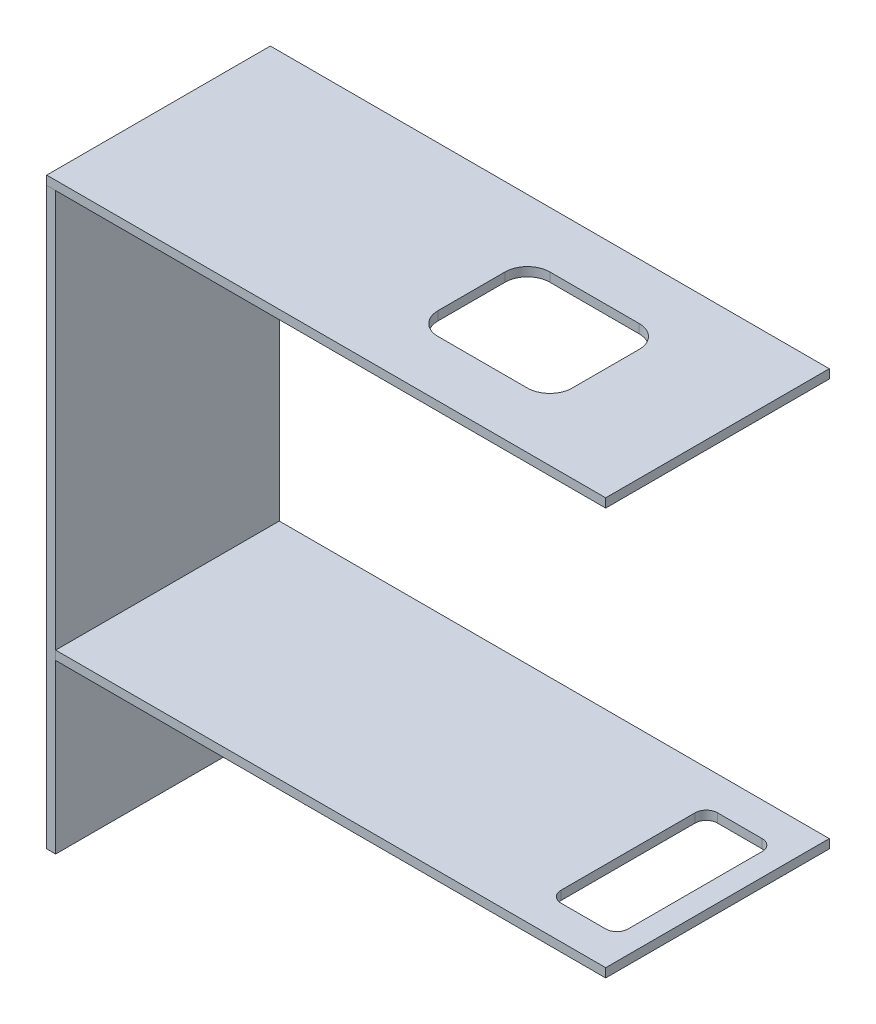
ISO-10303-21;
HEADER;
FILE_DESCRIPTION(('STEP AP214'),'2;1');
FILE_NAME('part.step','',(''),(''),'','','');
FILE_SCHEMA(('AUTOMOTIVE_DESIGN { 1 0 10303 214 1 1 1 1 }'));
ENDSEC;
DATA;
#1=APPLICATION_CONTEXT('core data for automotive mechanical design processes');
#2=APPLICATION_PROTOCOL_DEFINITION('international standard','automotive_design',2000,#1);
#3=PRODUCT_CONTEXT('',#1,'mechanical');
#4=PRODUCT('Part','Part','',(#3));
#5=PRODUCT_RELATED_PRODUCT_CATEGORY('part','',(#4));
#6=PRODUCT_DEFINITION_FORMATION('','',#4);
#7=PRODUCT_DEFINITION_CONTEXT('part definition',#1,'design');
#8=PRODUCT_DEFINITION('design','',#6,#7);
#9=PRODUCT_DEFINITION_SHAPE('','',#8);
#10=(LENGTH_UNIT() NAMED_UNIT(*) SI_UNIT(.MILLI.,.METRE.));
#11=(NAMED_UNIT(*) PLANE_ANGLE_UNIT() SI_UNIT($,.RADIAN.));
#12=(NAMED_UNIT(*) SI_UNIT($,.STERADIAN.) SOLID_ANGLE_UNIT());
#13=UNCERTAINTY_MEASURE_WITH_UNIT(LENGTH_MEASURE(1.E-05),#10,'distance_accuracy_value','');
#14=(GEOMETRIC_REPRESENTATION_CONTEXT(3) GLOBAL_UNCERTAINTY_ASSIGNED_CONTEXT((#13)) GLOBAL_UNIT_ASSIGNED_CONTEXT((#10,
#11,#12)) REPRESENTATION_CONTEXT('',''));
#15=CARTESIAN_POINT('',(0.,0.,0.));
#16=DIRECTION('',(0.,0.,1.));
#17=DIRECTION('',(1.,0.,0.));
#18=AXIS2_PLACEMENT_3D('',#15,#16,#17);
#19=CARTESIAN_POINT('',(124.,8.60422844084492E-13,100.));
#20=DIRECTION('',(-1.,0.,0.));
#21=DIRECTION('',(0.,-1.,0.));
#22=AXIS2_PLACEMENT_3D('',#19,#20,#21);
#23=PLANE('',#22);
#24=DIRECTION('',(0.,1.,0.));
#25=VECTOR('',#24,1.);
#26=CARTESIAN_POINT('',(124.,8.60422844084492E-13,0.));
#27=LINE('',#26,#25);
#28=CARTESIAN_POINT('',(124.,-53.5,0.));
#29=VERTEX_POINT('',#28);
#30=CARTESIAN_POINT('',(124.,-49.5,0.));
#31=VERTEX_POINT('',#30);
#32=EDGE_CURVE('E199',#29,#31,#27,.T.);
#33=ORIENTED_EDGE('',*,*,#32,.T.);
#34=DIRECTION('',(0.,0.,-1.));
#35=VECTOR('',#34,1.);
#36=CARTESIAN_POINT('',(124.,-49.5,100.));
#37=LINE('',#36,#35);
#38=CARTESIAN_POINT('',(124.,-49.5,100.));
#39=VERTEX_POINT('',#38);
#40=EDGE_CURVE('E12',#39,#31,#37,.T.);
#41=ORIENTED_EDGE('',*,*,#40,.F.);
#42=DIRECTION('',(0.,1.,0.));
#43=VECTOR('',#42,1.);
#44=CARTESIAN_POINT('',(124.,8.60422844084492E-13,100.));
#45=LINE('',#44,#43);
#46=CARTESIAN_POINT('',(124.,-53.5,100.));
#47=VERTEX_POINT('',#46);
#48=EDGE_CURVE('E188',#47,#39,#45,.T.);
#49=ORIENTED_EDGE('',*,*,#48,.F.);
#50=DIRECTION('',(0.,0.,-1.));
#51=VECTOR('',#50,1.);
#52=CARTESIAN_POINT('',(124.,-53.5,100.));
#53=LINE('',#52,#51);
#54=EDGE_CURVE('E198',#47,#29,#53,.T.);
#55=ORIENTED_EDGE('',*,*,#54,.T.);
#56=EDGE_LOOP('',(#33,#41,#49,#55));
#57=FACE_BOUND('',#56,.T.);
#58=ADVANCED_FACE('F46',(#57),#23,.F.);
#59=CARTESIAN_POINT('',(0.,-49.5,100.));
#60=DIRECTION('',(0.,-1.,0.));
#61=DIRECTION('',(1.,0.,0.));
#62=AXIS2_PLACEMENT_3D('',#59,#60,#61);
#63=PLANE('',#62);
#64=DIRECTION('',(1.,0.,0.));
#65=VECTOR('',#64,1.);
#66=CARTESIAN_POINT('',(0.,-49.5,15.));
#67=LINE('',#66,#65);
#68=CARTESIAN_POINT('',(89.,-49.5,15.));
#69=VERTEX_POINT('',#68);
#70=CARTESIAN_POINT('',(109.,-49.5,15.));
#71=VERTEX_POINT('',#70);
#72=EDGE_CURVE('E171',#69,#71,#67,.T.);
#73=ORIENTED_EDGE('',*,*,#72,.T.);
#74=CARTESIAN_POINT('',(109.,-49.5,20.));
#75=DIRECTION('',(0.,-1.,0.));
#76=DIRECTION('',(1.,0.,0.));
#77=AXIS2_PLACEMENT_3D('',#74,#75,#76);
#78=CIRCLE('',#77,5.);
#79=CARTESIAN_POINT('',(114.,-49.5,20.));
#80=VERTEX_POINT('',#79);
#81=EDGE_CURVE('E156',#71,#80,#78,.T.);
#82=ORIENTED_EDGE('',*,*,#81,.T.);
#83=DIRECTION('',(0.,0.,1.));
#84=VECTOR('',#83,1.);
#85=CARTESIAN_POINT('',(114.,-49.5,100.));
#86=LINE('',#85,#84);
#87=CARTESIAN_POINT('',(114.,-49.5,80.));
#88=VERTEX_POINT('',#87);
#89=EDGE_CURVE('E60',#80,#88,#86,.T.);
#90=ORIENTED_EDGE('',*,*,#89,.T.);
#91=CARTESIAN_POINT('',(109.,-49.5,80.));
#92=DIRECTION('',(0.,-1.,0.));
#93=DIRECTION('',(1.,0.,0.));
#94=AXIS2_PLACEMENT_3D('',#91,#92,#93);
#95=CIRCLE('',#94,5.);
#96=CARTESIAN_POINT('',(109.,-49.5,85.));
#97=VERTEX_POINT('',#96);
#98=EDGE_CURVE('E144',#88,#97,#95,.T.);
#99=ORIENTED_EDGE('',*,*,#98,.T.);
#100=DIRECTION('',(1.,0.,0.));
#101=VECTOR('',#100,1.);
#102=CARTESIAN_POINT('',(0.,-49.5,85.));
#103=LINE('',#102,#101);
#104=CARTESIAN_POINT('',(89.,-49.5,85.));
#105=VERTEX_POINT('',#104);
#106=EDGE_CURVE('E150',#105,#97,#103,.T.);
#107=ORIENTED_EDGE('',*,*,#106,.F.);
#108=CARTESIAN_POINT('',(89.,-49.5,80.));
#109=DIRECTION('',(0.,-1.,0.));
#110=DIRECTION('',(1.,0.,0.));
#111=AXIS2_PLACEMENT_3D('',#108,#109,#110);
#112=CIRCLE('',#111,5.);
#113=CARTESIAN_POINT('',(84.,-49.5,80.));
#114=VERTEX_POINT('',#113);
#115=EDGE_CURVE('E162',#105,#114,#112,.T.);
#116=ORIENTED_EDGE('',*,*,#115,.T.);
#117=DIRECTION('',(0.,0.,1.));
#118=VECTOR('',#117,1.);
#119=CARTESIAN_POINT('',(84.,-49.5,100.));
#120=LINE('',#119,#118);
#121=CARTESIAN_POINT('',(84.,-49.5,20.));
#122=VERTEX_POINT('',#121);
#123=EDGE_CURVE('E165',#122,#114,#120,.T.);
#124=ORIENTED_EDGE('',*,*,#123,.F.);
#125=CARTESIAN_POINT('',(89.,-49.5,20.));
#126=DIRECTION('',(0.,-1.,0.));
#127=DIRECTION('',(1.,0.,0.));
#128=AXIS2_PLACEMENT_3D('',#125,#126,#127);
#129=CIRCLE('',#128,5.);
#130=EDGE_CURVE('E168',#122,#69,#129,.T.);
#131=ORIENTED_EDGE('',*,*,#130,.T.);
#132=EDGE_LOOP('',(#73,#82,#90,#99,#107,#116,#124,#131));
#133=FACE_BOUND('',#132,.T.);
#134=DIRECTION('',(-1.,0.,0.));
#135=VECTOR('',#134,1.);
#136=CARTESIAN_POINT('',(0.,-49.5,0.));
#137=LINE('',#136,#135);
#138=CARTESIAN_POINT('',(-122.,-49.5,0.));
#139=VERTEX_POINT('',#138);
#140=EDGE_CURVE('E202',#31,#139,#137,.T.);
#141=ORIENTED_EDGE('',*,*,#140,.T.);
#142=DIRECTION('',(0.,0.,-1.));
#143=VECTOR('',#142,1.);
#144=CARTESIAN_POINT('',(-122.,-49.5,100.));
#145=LINE('',#144,#143);
#146=CARTESIAN_POINT('',(-122.,-49.5,100.));
#147=VERTEX_POINT('',#146);
#148=EDGE_CURVE('E53',#147,#139,#145,.T.);
#149=ORIENTED_EDGE('',*,*,#148,.F.);
#150=DIRECTION('',(-1.,0.,0.));
#151=VECTOR('',#150,1.);
#152=CARTESIAN_POINT('',(0.,-49.5,100.));
#153=LINE('',#152,#151);
#154=EDGE_CURVE('E191',#39,#147,#153,.T.);
#155=ORIENTED_EDGE('',*,*,#154,.F.);
#156=ORIENTED_EDGE('',*,*,#40,.T.);
#157=EDGE_LOOP('',(#141,#149,#155,#156));
#158=FACE_BOUND('',#157,.T.);
#159=ADVANCED_FACE('F154',(#133,#158),#63,.F.);
#160=CARTESIAN_POINT('',(-122.,0.,100.));
#161=DIRECTION('',(1.,0.,0.));
#162=DIRECTION('',(0.,1.,0.));
#163=AXIS2_PLACEMENT_3D('',#160,#161,#162);
#164=PLANE('',#163);
#165=DIRECTION('',(0.,-1.,0.));
#166=VECTOR('',#165,1.);
#167=CARTESIAN_POINT('',(-122.,0.,0.));
#168=LINE('',#167,#166);
#169=CARTESIAN_POINT('',(-122.,-53.5,0.));
#170=VERTEX_POINT('',#169);
#171=EDGE_CURVE('E205',#139,#170,#168,.T.);
#172=ORIENTED_EDGE('',*,*,#171,.T.);
#173=DIRECTION('',(0.,0.,-1.));
#174=VECTOR('',#173,1.);
#175=CARTESIAN_POINT('',(-122.,-53.5,100.));
#176=LINE('',#175,#174);
#177=CARTESIAN_POINT('',(-122.,-53.5,100.));
#178=VERTEX_POINT('',#177);
#179=EDGE_CURVE('E210',#178,#170,#176,.T.);
#180=ORIENTED_EDGE('',*,*,#179,.F.);
#181=DIRECTION('',(0.,-1.,0.));
#182=VECTOR('',#181,1.);
#183=CARTESIAN_POINT('',(-122.,0.,100.));
#184=LINE('',#183,#182);
#185=EDGE_CURVE('E194',#147,#178,#184,.T.);
#186=ORIENTED_EDGE('',*,*,#185,.F.);
#187=ORIENTED_EDGE('',*,*,#148,.T.);
#188=EDGE_LOOP('',(#172,#180,#186,#187));
#189=FACE_BOUND('',#188,.T.);
#190=ADVANCED_FACE('F217',(#189),#164,.F.);
#191=CARTESIAN_POINT('',(0.,-53.5,100.));
#192=DIRECTION('',(0.,1.,0.));
#193=DIRECTION('',(-1.,0.,0.));
#194=AXIS2_PLACEMENT_3D('',#191,#192,#193);
#195=PLANE('',#194);
#196=DIRECTION('',(-1.,0.,0.));
#197=VECTOR('',#196,1.);
#198=CARTESIAN_POINT('',(0.,-53.5,15.));
#199=LINE('',#198,#197);
#200=CARTESIAN_POINT('',(109.,-53.5,15.));
#201=VERTEX_POINT('',#200);
#202=CARTESIAN_POINT('',(89.,-53.5,15.));
#203=VERTEX_POINT('',#202);
#204=EDGE_CURVE('E184',#201,#203,#199,.T.);
#205=ORIENTED_EDGE('',*,*,#204,.T.);
#206=CARTESIAN_POINT('',(89.,-53.5,20.));
#207=DIRECTION('',(0.,1.,0.));
#208=DIRECTION('',(-1.,0.,0.));
#209=AXIS2_PLACEMENT_3D('',#206,#207,#208);
#210=CIRCLE('',#209,5.);
#211=CARTESIAN_POINT('',(84.,-53.5,20.));
#212=VERTEX_POINT('',#211);
#213=EDGE_CURVE('E187',#203,#212,#210,.T.);
#214=ORIENTED_EDGE('',*,*,#213,.T.);
#215=DIRECTION('',(0.,0.,-1.));
#216=VECTOR('',#215,1.);
#217=CARTESIAN_POINT('',(84.,-53.5,100.));
#218=LINE('',#217,#216);
#219=CARTESIAN_POINT('',(84.,-53.5,80.));
#220=VERTEX_POINT('',#219);
#221=EDGE_CURVE('E291',#220,#212,#218,.T.);
#222=ORIENTED_EDGE('',*,*,#221,.F.);
#223=CARTESIAN_POINT('',(89.,-53.5,80.));
#224=DIRECTION('',(0.,1.,0.));
#225=DIRECTION('',(-1.,0.,0.));
#226=AXIS2_PLACEMENT_3D('',#223,#224,#225);
#227=CIRCLE('',#226,5.);
#228=CARTESIAN_POINT('',(89.,-53.5,85.));
#229=VERTEX_POINT('',#228);
#230=EDGE_CURVE('E288',#220,#229,#227,.T.);
#231=ORIENTED_EDGE('',*,*,#230,.T.);
#232=DIRECTION('',(-1.,0.,0.));
#233=VECTOR('',#232,1.);
#234=CARTESIAN_POINT('',(0.,-53.5,85.));
#235=LINE('',#234,#233);
#236=CARTESIAN_POINT('',(109.,-53.5,85.));
#237=VERTEX_POINT('',#236);
#238=EDGE_CURVE('E286',#237,#229,#235,.T.);
#239=ORIENTED_EDGE('',*,*,#238,.F.);
#240=CARTESIAN_POINT('',(109.,-53.5,80.));
#241=DIRECTION('',(0.,1.,0.));
#242=DIRECTION('',(-1.,0.,0.));
#243=AXIS2_PLACEMENT_3D('',#240,#241,#242);
#244=CIRCLE('',#243,5.);
#245=CARTESIAN_POINT('',(114.,-53.5,80.));
#246=VERTEX_POINT('',#245);
#247=EDGE_CURVE('E282',#237,#246,#244,.T.);
#248=ORIENTED_EDGE('',*,*,#247,.T.);
#249=DIRECTION('',(0.,0.,-1.));
#250=VECTOR('',#249,1.);
#251=CARTESIAN_POINT('',(114.,-53.5,100.));
#252=LINE('',#251,#250);
#253=CARTESIAN_POINT('',(114.,-53.5,20.));
#254=VERTEX_POINT('',#253);
#255=EDGE_CURVE('E137',#246,#254,#252,.T.);
#256=ORIENTED_EDGE('',*,*,#255,.T.);
#257=CARTESIAN_POINT('',(109.,-53.5,20.));
#258=DIRECTION('',(0.,1.,0.));
#259=DIRECTION('',(-1.,0.,0.));
#260=AXIS2_PLACEMENT_3D('',#257,#258,#259);
#261=CIRCLE('',#260,5.);
#262=EDGE_CURVE('E203',#254,#201,#261,.T.);
#263=ORIENTED_EDGE('',*,*,#262,.T.);
#264=EDGE_LOOP('',(#205,#214,#222,#231,#239,#248,#256,#263));
#265=FACE_BOUND('',#264,.T.);
#266=DIRECTION('',(1.,0.,0.));
#267=VECTOR('',#266,1.);
#268=CARTESIAN_POINT('',(0.,-53.5,0.));
#269=LINE('',#268,#267);
#270=EDGE_CURVE('E192',#170,#29,#269,.T.);
#271=ORIENTED_EDGE('',*,*,#270,.T.);
#272=ORIENTED_EDGE('',*,*,#54,.F.);
#273=DIRECTION('',(1.,0.,0.));
#274=VECTOR('',#273,1.);
#275=CARTESIAN_POINT('',(0.,-53.5,100.));
#276=LINE('',#275,#274);
#277=EDGE_CURVE('E196',#178,#47,#276,.T.);
#278=ORIENTED_EDGE('',*,*,#277,.F.);
#279=ORIENTED_EDGE('',*,*,#179,.T.);
#280=EDGE_LOOP('',(#271,#272,#278,#279));
#281=FACE_BOUND('',#280,.T.);
#282=ADVANCED_FACE('F225',(#265,#281),#195,.F.);
#283=CARTESIAN_POINT('',(0.,0.,100.));
#284=DIRECTION('',(0.,0.,1.));
#285=DIRECTION('',(1.,0.,0.));
#286=AXIS2_PLACEMENT_3D('',#283,#284,#285);
#287=PLANE('',#286);
#288=ORIENTED_EDGE('',*,*,#48,.T.);
#289=ORIENTED_EDGE('',*,*,#154,.T.);
#290=ORIENTED_EDGE('',*,*,#185,.T.);
#291=ORIENTED_EDGE('',*,*,#277,.T.);
#292=EDGE_LOOP('',(#288,#289,#290,#291));
#293=FACE_BOUND('',#292,.T.);
#294=ADVANCED_FACE('F231',(#293),#287,.T.);
#295=CARTESIAN_POINT('',(0.,0.,0.));
#296=DIRECTION('',(0.,0.,1.));
#297=DIRECTION('',(1.,0.,0.));
#298=AXIS2_PLACEMENT_3D('',#295,#296,#297);
#299=PLANE('',#298);
#300=ORIENTED_EDGE('',*,*,#32,.F.);
#301=ORIENTED_EDGE('',*,*,#270,.F.);
#302=ORIENTED_EDGE('',*,*,#171,.F.);
#303=ORIENTED_EDGE('',*,*,#140,.F.);
#304=EDGE_LOOP('',(#300,#301,#302,#303));
#305=FACE_BOUND('',#304,.T.);
#306=ADVANCED_FACE('F222',(#305),#299,.F.);
#307=CARTESIAN_POINT('',(0.,-129.657731058639,15.));
#308=DIRECTION('',(0.,0.,1.));
#309=DIRECTION('',(1.,0.,0.));
#310=AXIS2_PLACEMENT_3D('',#307,#308,#309);
#311=PLANE('',#310);
#312=DIRECTION('',(0.,1.,0.));
#313=VECTOR('',#312,1.);
#314=CARTESIAN_POINT('',(109.,-129.657731058639,15.));
#315=LINE('',#314,#313);
#316=EDGE_CURVE('E68',#201,#71,#315,.T.);
#317=ORIENTED_EDGE('',*,*,#316,.T.);
#318=ORIENTED_EDGE('',*,*,#72,.F.);
#319=DIRECTION('',(0.,1.,0.));
#320=VECTOR('',#319,1.);
#321=CARTESIAN_POINT('',(89.,-129.657731058639,15.));
#322=LINE('',#321,#320);
#323=EDGE_CURVE('E174',#203,#69,#322,.T.);
#324=ORIENTED_EDGE('',*,*,#323,.F.);
#325=ORIENTED_EDGE('',*,*,#204,.F.);
#326=EDGE_LOOP('',(#317,#318,#324,#325));
#327=FACE_BOUND('',#326,.T.);
#328=ADVANCED_FACE('F244',(#327),#311,.T.);
#329=CARTESIAN_POINT('',(89.,-129.657731058639,20.));
#330=DIRECTION('',(0.,1.,0.));
#331=DIRECTION('',(-1.,0.,0.));
#332=AXIS2_PLACEMENT_3D('',#329,#330,#331);
#333=CYLINDRICAL_SURFACE('',#332,5.);
#334=ORIENTED_EDGE('',*,*,#323,.T.);
#335=ORIENTED_EDGE('',*,*,#130,.F.);
#336=DIRECTION('',(0.,1.,0.));
#337=VECTOR('',#336,1.);
#338=CARTESIAN_POINT('',(84.,-129.657731058639,20.));
#339=LINE('',#338,#337);
#340=EDGE_CURVE('E176',#212,#122,#339,.T.);
#341=ORIENTED_EDGE('',*,*,#340,.F.);
#342=ORIENTED_EDGE('',*,*,#213,.F.);
#343=EDGE_LOOP('',(#334,#335,#341,#342));
#344=FACE_BOUND('',#343,.T.);
#345=ADVANCED_FACE('F265',(#344),#333,.F.);
#346=CARTESIAN_POINT('',(84.,-129.657731058639,100.));
#347=DIRECTION('',(-1.,0.,0.));
#348=DIRECTION('',(0.,0.,1.));
#349=AXIS2_PLACEMENT_3D('',#346,#347,#348);
#350=PLANE('',#349);
#351=ORIENTED_EDGE('',*,*,#221,.T.);
#352=ORIENTED_EDGE('',*,*,#340,.T.);
#353=ORIENTED_EDGE('',*,*,#123,.T.);
#354=DIRECTION('',(0.,1.,0.));
#355=VECTOR('',#354,1.);
#356=CARTESIAN_POINT('',(84.,-129.657731058639,80.));
#357=LINE('',#356,#355);
#358=EDGE_CURVE('E178',#220,#114,#357,.T.);
#359=ORIENTED_EDGE('',*,*,#358,.F.);
#360=EDGE_LOOP('',(#351,#352,#353,#359));
#361=FACE_BOUND('',#360,.T.);
#362=ADVANCED_FACE('F261',(#361),#350,.F.);
#363=CARTESIAN_POINT('',(89.,-129.657731058639,80.));
#364=DIRECTION('',(0.,1.,0.));
#365=DIRECTION('',(-1.,0.,0.));
#366=AXIS2_PLACEMENT_3D('',#363,#364,#365);
#367=CYLINDRICAL_SURFACE('',#366,5.);
#368=ORIENTED_EDGE('',*,*,#358,.T.);
#369=ORIENTED_EDGE('',*,*,#115,.F.);
#370=DIRECTION('',(0.,1.,0.));
#371=VECTOR('',#370,1.);
#372=CARTESIAN_POINT('',(89.,-129.657731058639,85.));
#373=LINE('',#372,#371);
#374=EDGE_CURVE('E180',#229,#105,#373,.T.);
#375=ORIENTED_EDGE('',*,*,#374,.F.);
#376=ORIENTED_EDGE('',*,*,#230,.F.);
#377=EDGE_LOOP('',(#368,#369,#375,#376));
#378=FACE_BOUND('',#377,.T.);
#379=ADVANCED_FACE('F257',(#378),#367,.F.);
#380=CARTESIAN_POINT('',(0.,-129.657731058639,85.));
#381=DIRECTION('',(0.,0.,1.));
#382=DIRECTION('',(1.,0.,0.));
#383=AXIS2_PLACEMENT_3D('',#380,#381,#382);
#384=PLANE('',#383);
#385=ORIENTED_EDGE('',*,*,#238,.T.);
#386=ORIENTED_EDGE('',*,*,#374,.T.);
#387=ORIENTED_EDGE('',*,*,#106,.T.);
#388=DIRECTION('',(0.,1.,0.));
#389=VECTOR('',#388,1.);
#390=CARTESIAN_POINT('',(109.,-129.657731058639,85.));
#391=LINE('',#390,#389);
#392=EDGE_CURVE('E141',#237,#97,#391,.T.);
#393=ORIENTED_EDGE('',*,*,#392,.F.);
#394=EDGE_LOOP('',(#385,#386,#387,#393));
#395=FACE_BOUND('',#394,.T.);
#396=ADVANCED_FACE('F254',(#395),#384,.F.);
#397=CARTESIAN_POINT('',(109.,-129.657731058639,80.));
#398=DIRECTION('',(0.,1.,0.));
#399=DIRECTION('',(-1.,0.,0.));
#400=AXIS2_PLACEMENT_3D('',#397,#398,#399);
#401=CYLINDRICAL_SURFACE('',#400,5.);
#402=ORIENTED_EDGE('',*,*,#392,.T.);
#403=ORIENTED_EDGE('',*,*,#98,.F.);
#404=DIRECTION('',(0.,1.,0.));
#405=VECTOR('',#404,1.);
#406=CARTESIAN_POINT('',(114.,-129.657731058639,80.));
#407=LINE('',#406,#405);
#408=EDGE_CURVE('E133',#246,#88,#407,.T.);
#409=ORIENTED_EDGE('',*,*,#408,.F.);
#410=ORIENTED_EDGE('',*,*,#247,.F.);
#411=EDGE_LOOP('',(#402,#403,#409,#410));
#412=FACE_BOUND('',#411,.T.);
#413=ADVANCED_FACE('F145',(#412),#401,.F.);
#414=CARTESIAN_POINT('',(114.,-129.657731058639,100.));
#415=DIRECTION('',(-1.,0.,0.));
#416=DIRECTION('',(0.,0.,1.));
#417=AXIS2_PLACEMENT_3D('',#414,#415,#416);
#418=PLANE('',#417);
#419=ORIENTED_EDGE('',*,*,#408,.T.);
#420=ORIENTED_EDGE('',*,*,#89,.F.);
#421=DIRECTION('',(0.,1.,0.));
#422=VECTOR('',#421,1.);
#423=CARTESIAN_POINT('',(114.,-129.657731058639,20.));
#424=LINE('',#423,#422);
#425=EDGE_CURVE('E140',#254,#80,#424,.T.);
#426=ORIENTED_EDGE('',*,*,#425,.F.);
#427=ORIENTED_EDGE('',*,*,#255,.F.);
#428=EDGE_LOOP('',(#419,#420,#426,#427));
#429=FACE_BOUND('',#428,.T.);
#430=ADVANCED_FACE('F135',(#429),#418,.T.);
#431=CARTESIAN_POINT('',(109.,-129.657731058639,20.));
#432=DIRECTION('',(0.,1.,0.));
#433=DIRECTION('',(-1.,0.,0.));
#434=AXIS2_PLACEMENT_3D('',#431,#432,#433);
#435=CYLINDRICAL_SURFACE('',#434,5.);
#436=ORIENTED_EDGE('',*,*,#425,.T.);
#437=ORIENTED_EDGE('',*,*,#81,.F.);
#438=ORIENTED_EDGE('',*,*,#316,.F.);
#439=ORIENTED_EDGE('',*,*,#262,.F.);
#440=EDGE_LOOP('',(#436,#437,#438,#439));
#441=FACE_BOUND('',#440,.T.);
#442=ADVANCED_FACE('F247',(#441),#435,.F.);
#443=CLOSED_SHELL('',(#58,#159,#190,#282,#294,#306,#328,#345,#362,#379,#396,#413,#430,#442));
#444=MANIFOLD_SOLID_BREP('B2',#443);
#445=CARTESIAN_POINT('',(-122.,0.,100.));
#446=DIRECTION('',(1.,0.,0.));
#447=DIRECTION('',(0.,1.,0.));
#448=AXIS2_PLACEMENT_3D('',#445,#446,#447);
#449=PLANE('',#448);
#450=DIRECTION('',(0.,-1.,0.));
#451=VECTOR('',#450,1.);
#452=CARTESIAN_POINT('',(-122.,0.,0.));
#453=LINE('',#452,#451);
#454=CARTESIAN_POINT('',(-122.,128.5,0.));
#455=VERTEX_POINT('',#454);
#456=CARTESIAN_POINT('',(-122.,-128.5,0.));
#457=VERTEX_POINT('',#456);
#458=EDGE_CURVE('E454',#455,#457,#453,.T.);
#459=ORIENTED_EDGE('',*,*,#458,.F.);
#460=DIRECTION('',(0.,0.,-1.));
#461=VECTOR('',#460,1.);
#462=CARTESIAN_POINT('',(-122.,128.5,100.));
#463=LINE('',#462,#461);
#464=CARTESIAN_POINT('',(-122.,128.5,100.));
#465=VERTEX_POINT('',#464);
#466=EDGE_CURVE('E44',#465,#455,#463,.T.);
#467=ORIENTED_EDGE('',*,*,#466,.F.);
#468=DIRECTION('',(0.,-1.,0.));
#469=VECTOR('',#468,1.);
#470=CARTESIAN_POINT('',(-122.,0.,100.));
#471=LINE('',#470,#469);
#472=CARTESIAN_POINT('',(-122.,-128.5,100.));
#473=VERTEX_POINT('',#472);
#474=EDGE_CURVE('E442',#465,#473,#471,.T.);
#475=ORIENTED_EDGE('',*,*,#474,.T.);
#476=DIRECTION('',(0.,0.,-1.));
#477=VECTOR('',#476,1.);
#478=CARTESIAN_POINT('',(-122.,-128.5,100.));
#479=LINE('',#478,#477);
#480=EDGE_CURVE('E431',#473,#457,#479,.T.);
#481=ORIENTED_EDGE('',*,*,#480,.T.);
#482=EDGE_LOOP('',(#459,#467,#475,#481));
#483=FACE_BOUND('',#482,.T.);
#484=ADVANCED_FACE('F392',(#483),#449,.T.);
#485=CARTESIAN_POINT('',(0.,128.5,100.));
#486=DIRECTION('',(0.,-1.,0.));
#487=DIRECTION('',(0.,0.,-1.));
#488=AXIS2_PLACEMENT_3D('',#485,#486,#487);
#489=PLANE('',#488);
#490=DIRECTION('',(-1.,0.,0.));
#491=VECTOR('',#490,1.);
#492=CARTESIAN_POINT('',(0.,128.5,0.));
#493=LINE('',#492,#491);
#494=CARTESIAN_POINT('',(-126.,128.5,0.));
#495=VERTEX_POINT('',#494);
#496=EDGE_CURVE('E447',#455,#495,#493,.T.);
#497=ORIENTED_EDGE('',*,*,#496,.T.);
#498=DIRECTION('',(0.,0.,-1.));
#499=VECTOR('',#498,1.);
#500=CARTESIAN_POINT('',(-126.,128.5,100.));
#501=LINE('',#500,#499);
#502=CARTESIAN_POINT('',(-126.,128.5,100.));
#503=VERTEX_POINT('',#502);
#504=EDGE_CURVE('E400',#503,#495,#501,.T.);
#505=ORIENTED_EDGE('',*,*,#504,.F.);
#506=DIRECTION('',(-1.,0.,0.));
#507=VECTOR('',#506,1.);
#508=CARTESIAN_POINT('',(0.,128.5,100.));
#509=LINE('',#508,#507);
#510=EDGE_CURVE('E437',#465,#503,#509,.T.);
#511=ORIENTED_EDGE('',*,*,#510,.F.);
#512=ORIENTED_EDGE('',*,*,#466,.T.);
#513=EDGE_LOOP('',(#497,#505,#511,#512));
#514=FACE_BOUND('',#513,.T.);
#515=ADVANCED_FACE('F445',(#514),#489,.F.);
#516=CARTESIAN_POINT('',(-126.,0.,100.));
#517=DIRECTION('',(1.,0.,0.));
#518=DIRECTION('',(0.,1.,0.));
#519=AXIS2_PLACEMENT_3D('',#516,#517,#518);
#520=PLANE('',#519);
#521=DIRECTION('',(0.,-1.,0.));
#522=VECTOR('',#521,1.);
#523=CARTESIAN_POINT('',(-126.,0.,0.));
#524=LINE('',#523,#522);
#525=CARTESIAN_POINT('',(-126.,-128.5,0.));
#526=VERTEX_POINT('',#525);
#527=EDGE_CURVE('E424',#495,#526,#524,.T.);
#528=ORIENTED_EDGE('',*,*,#527,.T.);
#529=DIRECTION('',(0.,0.,-1.));
#530=VECTOR('',#529,1.);
#531=CARTESIAN_POINT('',(-126.,-128.5,100.));
#532=LINE('',#531,#530);
#533=CARTESIAN_POINT('',(-126.,-128.5,100.));
#534=VERTEX_POINT('',#533);
#535=EDGE_CURVE('E448',#534,#526,#532,.T.);
#536=ORIENTED_EDGE('',*,*,#535,.F.);
#537=DIRECTION('',(0.,-1.,0.));
#538=VECTOR('',#537,1.);
#539=CARTESIAN_POINT('',(-126.,0.,100.));
#540=LINE('',#539,#538);
#541=EDGE_CURVE('E441',#503,#534,#540,.T.);
#542=ORIENTED_EDGE('',*,*,#541,.F.);
#543=ORIENTED_EDGE('',*,*,#504,.T.);
#544=EDGE_LOOP('',(#528,#536,#542,#543));
#545=FACE_BOUND('',#544,.T.);
#546=ADVANCED_FACE('F449',(#545),#520,.F.);
#547=CARTESIAN_POINT('',(0.,-128.5,100.));
#548=DIRECTION('',(0.,1.,0.));
#549=DIRECTION('',(0.,0.,1.));
#550=AXIS2_PLACEMENT_3D('',#547,#548,#549);
#551=PLANE('',#550);
#552=DIRECTION('',(1.,0.,0.));
#553=VECTOR('',#552,1.);
#554=CARTESIAN_POINT('',(0.,-128.5,0.));
#555=LINE('',#554,#553);
#556=EDGE_CURVE('E459',#526,#457,#555,.T.);
#557=ORIENTED_EDGE('',*,*,#556,.T.);
#558=ORIENTED_EDGE('',*,*,#480,.F.);
#559=DIRECTION('',(1.,0.,0.));
#560=VECTOR('',#559,1.);
#561=CARTESIAN_POINT('',(0.,-128.5,100.));
#562=LINE('',#561,#560);
#563=EDGE_CURVE('E408',#534,#473,#562,.T.);
#564=ORIENTED_EDGE('',*,*,#563,.F.);
#565=ORIENTED_EDGE('',*,*,#535,.T.);
#566=EDGE_LOOP('',(#557,#558,#564,#565));
#567=FACE_BOUND('',#566,.T.);
#568=ADVANCED_FACE('F464',(#567),#551,.F.);
#569=CARTESIAN_POINT('',(0.,0.,100.));
#570=DIRECTION('',(0.,0.,1.));
#571=DIRECTION('',(1.,0.,0.));
#572=AXIS2_PLACEMENT_3D('',#569,#570,#571);
#573=PLANE('',#572);
#574=ORIENTED_EDGE('',*,*,#474,.F.);
#575=ORIENTED_EDGE('',*,*,#510,.T.);
#576=ORIENTED_EDGE('',*,*,#541,.T.);
#577=ORIENTED_EDGE('',*,*,#563,.T.);
#578=EDGE_LOOP('',(#574,#575,#576,#577));
#579=FACE_BOUND('',#578,.T.);
#580=ADVANCED_FACE('F439',(#579),#573,.T.);
#581=CARTESIAN_POINT('',(0.,0.,0.));
#582=DIRECTION('',(0.,0.,1.));
#583=DIRECTION('',(1.,0.,0.));
#584=AXIS2_PLACEMENT_3D('',#581,#582,#583);
#585=PLANE('',#584);
#586=ORIENTED_EDGE('',*,*,#458,.T.);
#587=ORIENTED_EDGE('',*,*,#556,.F.);
#588=ORIENTED_EDGE('',*,*,#527,.F.);
#589=ORIENTED_EDGE('',*,*,#496,.F.);
#590=EDGE_LOOP('',(#586,#587,#588,#589));
#591=FACE_BOUND('',#590,.T.);
#592=ADVANCED_FACE('F466',(#591),#585,.F.);
#593=CLOSED_SHELL('',(#484,#515,#546,#568,#580,#592));
#594=MANIFOLD_SOLID_BREP('B6',#593);
#595=CARTESIAN_POINT('',(0.,132.5,100.));
#596=DIRECTION('',(0.,-1.,0.));
#597=DIRECTION('',(0.,0.,-1.));
#598=AXIS2_PLACEMENT_3D('',#595,#596,#597);
#599=PLANE('',#598);
#600=DIRECTION('',(-1.,0.,0.));
#601=VECTOR('',#600,1.);
#602=CARTESIAN_POINT('',(0.,132.5,0.));
#603=LINE('',#602,#601);
#604=CARTESIAN_POINT('',(124.,132.5,0.));
#605=VERTEX_POINT('',#604);
#606=CARTESIAN_POINT('',(-126.,132.5,0.));
#607=VERTEX_POINT('',#606);
#608=EDGE_CURVE('E642',#605,#607,#603,.T.);
#609=ORIENTED_EDGE('',*,*,#608,.T.);
#610=DIRECTION('',(0.,0.,-1.));
#611=VECTOR('',#610,1.);
#612=CARTESIAN_POINT('',(-126.,132.5,100.));
#613=LINE('',#612,#611);
#614=CARTESIAN_POINT('',(-126.,132.5,100.));
#615=VERTEX_POINT('',#614);
#616=EDGE_CURVE('E390',#615,#607,#613,.T.);
#617=ORIENTED_EDGE('',*,*,#616,.F.);
#618=DIRECTION('',(-1.,0.,0.));
#619=VECTOR('',#618,1.);
#620=CARTESIAN_POINT('',(0.,132.5,100.));
#621=LINE('',#620,#619);
#622=CARTESIAN_POINT('',(124.,132.5,100.));
#623=VERTEX_POINT('',#622);
#624=EDGE_CURVE('E662',#623,#615,#621,.T.);
#625=ORIENTED_EDGE('',*,*,#624,.F.);
#626=DIRECTION('',(0.,0.,-1.));
#627=VECTOR('',#626,1.);
#628=CARTESIAN_POINT('',(124.,132.5,100.));
#629=LINE('',#628,#627);
#630=EDGE_CURVE('E674',#623,#605,#629,.T.);
#631=ORIENTED_EDGE('',*,*,#630,.T.);
#632=EDGE_LOOP('',(#609,#617,#625,#631));
#633=FACE_BOUND('',#632,.T.);
#634=CARTESIAN_POINT('',(64.,132.5,35.));
#635=DIRECTION('',(0.,-1.,0.));
#636=DIRECTION('',(0.,0.,-1.));
#637=AXIS2_PLACEMENT_3D('',#634,#635,#636);
#638=CIRCLE('',#637,10.);
#639=CARTESIAN_POINT('',(64.,132.5,25.));
#640=VERTEX_POINT('',#639);
#641=CARTESIAN_POINT('',(74.,132.5,35.));
#642=VERTEX_POINT('',#641);
#643=EDGE_CURVE('E660',#640,#642,#638,.T.);
#644=ORIENTED_EDGE('',*,*,#643,.T.);
#645=DIRECTION('',(0.,0.,-1.));
#646=VECTOR('',#645,1.);
#647=CARTESIAN_POINT('',(74.,132.5,100.));
#648=LINE('',#647,#646);
#649=CARTESIAN_POINT('',(74.,132.5,65.));
#650=VERTEX_POINT('',#649);
#651=EDGE_CURVE('E536',#650,#642,#648,.T.);
#652=ORIENTED_EDGE('',*,*,#651,.F.);
#653=CARTESIAN_POINT('',(64.,132.5,65.));
#654=DIRECTION('',(0.,-1.,0.));
#655=DIRECTION('',(0.,0.,-1.));
#656=AXIS2_PLACEMENT_3D('',#653,#654,#655);
#657=CIRCLE('',#656,9.99999999999999);
#658=CARTESIAN_POINT('',(64.,132.5,75.));
#659=VERTEX_POINT('',#658);
#660=EDGE_CURVE('E617',#650,#659,#657,.T.);
#661=ORIENTED_EDGE('',*,*,#660,.T.);
#662=DIRECTION('',(1.,0.,0.));
#663=VECTOR('',#662,1.);
#664=CARTESIAN_POINT('',(0.,132.5,75.));
#665=LINE('',#664,#663);
#666=CARTESIAN_POINT('',(24.,132.5,75.));
#667=VERTEX_POINT('',#666);
#668=EDGE_CURVE('E632',#667,#659,#665,.T.);
#669=ORIENTED_EDGE('',*,*,#668,.F.);
#670=CARTESIAN_POINT('',(24.,132.5,65.));
#671=DIRECTION('',(0.,-1.,0.));
#672=DIRECTION('',(0.,0.,-1.));
#673=AXIS2_PLACEMENT_3D('',#670,#671,#672);
#674=CIRCLE('',#673,10.);
#675=CARTESIAN_POINT('',(14.,132.5,65.));
#676=VERTEX_POINT('',#675);
#677=EDGE_CURVE('E648',#667,#676,#674,.T.);
#678=ORIENTED_EDGE('',*,*,#677,.T.);
#679=DIRECTION('',(0.,0.,-1.));
#680=VECTOR('',#679,1.);
#681=CARTESIAN_POINT('',(14.,132.5,100.));
#682=LINE('',#681,#680);
#683=CARTESIAN_POINT('',(14.,132.5,35.));
#684=VERTEX_POINT('',#683);
#685=EDGE_CURVE('E651',#676,#684,#682,.T.);
#686=ORIENTED_EDGE('',*,*,#685,.T.);
#687=CARTESIAN_POINT('',(24.,132.5,35.));
#688=DIRECTION('',(0.,-1.,0.));
#689=DIRECTION('',(0.,0.,-1.));
#690=AXIS2_PLACEMENT_3D('',#687,#688,#689);
#691=CIRCLE('',#690,10.);
#692=CARTESIAN_POINT('',(24.,132.5,25.));
#693=VERTEX_POINT('',#692);
#694=EDGE_CURVE('E654',#684,#693,#691,.T.);
#695=ORIENTED_EDGE('',*,*,#694,.T.);
#696=DIRECTION('',(1.,0.,0.));
#697=VECTOR('',#696,1.);
#698=CARTESIAN_POINT('',(0.,132.5,25.));
#699=LINE('',#698,#697);
#700=EDGE_CURVE('E657',#693,#640,#699,.T.);
#701=ORIENTED_EDGE('',*,*,#700,.T.);
#702=EDGE_LOOP('',(#644,#652,#661,#669,#678,#686,#695,#701));
#703=FACE_BOUND('',#702,.T.);
#704=ADVANCED_FACE('F522',(#633,#703),#599,.F.);
#705=CARTESIAN_POINT('',(0.,128.5,100.));
#706=DIRECTION('',(0.,-1.,0.));
#707=DIRECTION('',(0.,0.,-1.));
#708=AXIS2_PLACEMENT_3D('',#705,#706,#707);
#709=PLANE('',#708);
#710=DIRECTION('',(-1.,0.,0.));
#711=VECTOR('',#710,1.);
#712=CARTESIAN_POINT('',(0.,128.5,0.));
#713=LINE('',#712,#711);
#714=CARTESIAN_POINT('',(124.,128.5,0.));
#715=VERTEX_POINT('',#714);
#716=CARTESIAN_POINT('',(-126.,128.5,0.));
#717=VERTEX_POINT('',#716);
#718=EDGE_CURVE('E680',#715,#717,#713,.T.);
#719=ORIENTED_EDGE('',*,*,#718,.F.);
#720=DIRECTION('',(0.,0.,-1.));
#721=VECTOR('',#720,1.);
#722=CARTESIAN_POINT('',(124.,128.5,100.));
#723=LINE('',#722,#721);
#724=CARTESIAN_POINT('',(124.,128.5,100.));
#725=VERTEX_POINT('',#724);
#726=EDGE_CURVE('E686',#725,#715,#723,.T.);
#727=ORIENTED_EDGE('',*,*,#726,.F.);
#728=DIRECTION('',(-1.,0.,0.));
#729=VECTOR('',#728,1.);
#730=CARTESIAN_POINT('',(0.,128.5,100.));
#731=LINE('',#730,#729);
#732=CARTESIAN_POINT('',(-126.,128.5,100.));
#733=VERTEX_POINT('',#732);
#734=EDGE_CURVE('E668',#725,#733,#731,.T.);
#735=ORIENTED_EDGE('',*,*,#734,.T.);
#736=DIRECTION('',(0.,0.,-1.));
#737=VECTOR('',#736,1.);
#738=CARTESIAN_POINT('',(-126.,128.5,100.));
#739=LINE('',#738,#737);
#740=EDGE_CURVE('E529',#733,#717,#739,.T.);
#741=ORIENTED_EDGE('',*,*,#740,.T.);
#742=EDGE_LOOP('',(#719,#727,#735,#741));
#743=FACE_BOUND('',#742,.T.);
#744=DIRECTION('',(0.,0.,-1.));
#745=VECTOR('',#744,1.);
#746=CARTESIAN_POINT('',(74.,128.5,100.));
#747=LINE('',#746,#745);
#748=CARTESIAN_POINT('',(74.,128.5,65.));
#749=VERTEX_POINT('',#748);
#750=CARTESIAN_POINT('',(74.,128.5,35.));
#751=VERTEX_POINT('',#750);
#752=EDGE_CURVE('E621',#749,#751,#747,.T.);
#753=ORIENTED_EDGE('',*,*,#752,.T.);
#754=CARTESIAN_POINT('',(64.,128.5,35.));
#755=DIRECTION('',(0.,-1.,0.));
#756=DIRECTION('',(0.,0.,-1.));
#757=AXIS2_PLACEMENT_3D('',#754,#755,#756);
#758=CIRCLE('',#757,10.);
#759=CARTESIAN_POINT('',(64.,128.5,25.));
#760=VERTEX_POINT('',#759);
#761=EDGE_CURVE('E641',#760,#751,#758,.T.);
#762=ORIENTED_EDGE('',*,*,#761,.F.);
#763=DIRECTION('',(1.,0.,0.));
#764=VECTOR('',#763,1.);
#765=CARTESIAN_POINT('',(0.,128.5,25.));
#766=LINE('',#765,#764);
#767=CARTESIAN_POINT('',(24.,128.5,25.));
#768=VERTEX_POINT('',#767);
#769=EDGE_CURVE('E544',#768,#760,#766,.T.);
#770=ORIENTED_EDGE('',*,*,#769,.F.);
#771=CARTESIAN_POINT('',(24.,128.5,35.));
#772=DIRECTION('',(0.,-1.,0.));
#773=DIRECTION('',(0.,0.,-1.));
#774=AXIS2_PLACEMENT_3D('',#771,#772,#773);
#775=CIRCLE('',#774,10.);
#776=CARTESIAN_POINT('',(14.,128.5,35.));
#777=VERTEX_POINT('',#776);
#778=EDGE_CURVE('E719',#777,#768,#775,.T.);
#779=ORIENTED_EDGE('',*,*,#778,.F.);
#780=DIRECTION('',(0.,0.,-1.));
#781=VECTOR('',#780,1.);
#782=CARTESIAN_POINT('',(14.,128.5,100.));
#783=LINE('',#782,#781);
#784=CARTESIAN_POINT('',(14.,128.5,65.));
#785=VERTEX_POINT('',#784);
#786=EDGE_CURVE('E635',#785,#777,#783,.T.);
#787=ORIENTED_EDGE('',*,*,#786,.F.);
#788=CARTESIAN_POINT('',(24.,128.5,65.));
#789=DIRECTION('',(0.,-1.,0.));
#790=DIRECTION('',(0.,0.,-1.));
#791=AXIS2_PLACEMENT_3D('',#788,#789,#790);
#792=CIRCLE('',#791,10.);
#793=CARTESIAN_POINT('',(24.,128.5,75.));
#794=VERTEX_POINT('',#793);
#795=EDGE_CURVE('E631',#794,#785,#792,.T.);
#796=ORIENTED_EDGE('',*,*,#795,.F.);
#797=DIRECTION('',(1.,0.,0.));
#798=VECTOR('',#797,1.);
#799=CARTESIAN_POINT('',(0.,128.5,75.));
#800=LINE('',#799,#798);
#801=CARTESIAN_POINT('',(64.,128.5,75.));
#802=VERTEX_POINT('',#801);
#803=EDGE_CURVE('E630',#794,#802,#800,.T.);
#804=ORIENTED_EDGE('',*,*,#803,.T.);
#805=CARTESIAN_POINT('',(64.,128.5,65.));
#806=DIRECTION('',(0.,-1.,0.));
#807=DIRECTION('',(0.,0.,-1.));
#808=AXIS2_PLACEMENT_3D('',#805,#806,#807);
#809=CIRCLE('',#808,9.99999999999999);
#810=EDGE_CURVE('E614',#749,#802,#809,.T.);
#811=ORIENTED_EDGE('',*,*,#810,.F.);
#812=EDGE_LOOP('',(#753,#762,#770,#779,#787,#796,#804,#811));
#813=FACE_BOUND('',#812,.T.);
#814=ADVANCED_FACE('F627',(#743,#813),#709,.T.);
#815=CARTESIAN_POINT('',(-126.,0.,100.));
#816=DIRECTION('',(1.,0.,0.));
#817=DIRECTION('',(0.,0.,-1.));
#818=AXIS2_PLACEMENT_3D('',#815,#816,#817);
#819=PLANE('',#818);
#820=DIRECTION('',(0.,-1.,0.));
#821=VECTOR('',#820,1.);
#822=CARTESIAN_POINT('',(-126.,0.,0.));
#823=LINE('',#822,#821);
#824=EDGE_CURVE('E677',#607,#717,#823,.T.);
#825=ORIENTED_EDGE('',*,*,#824,.T.);
#826=ORIENTED_EDGE('',*,*,#740,.F.);
#827=DIRECTION('',(0.,-1.,0.));
#828=VECTOR('',#827,1.);
#829=CARTESIAN_POINT('',(-126.,0.,100.));
#830=LINE('',#829,#828);
#831=EDGE_CURVE('E665',#615,#733,#830,.T.);
#832=ORIENTED_EDGE('',*,*,#831,.F.);
#833=ORIENTED_EDGE('',*,*,#616,.T.);
#834=EDGE_LOOP('',(#825,#826,#832,#833));
#835=FACE_BOUND('',#834,.T.);
#836=ADVANCED_FACE('F692',(#835),#819,.F.);
#837=CARTESIAN_POINT('',(123.999999999999,-8.60422844084489E-13,100.));
#838=DIRECTION('',(1.,0.,0.));
#839=DIRECTION('',(0.,1.,0.));
#840=AXIS2_PLACEMENT_3D('',#837,#838,#839);
#841=PLANE('',#840);
#842=DIRECTION('',(0.,-1.,0.));
#843=VECTOR('',#842,1.);
#844=CARTESIAN_POINT('',(123.999999999999,-8.60422844084489E-13,0.));
#845=LINE('',#844,#843);
#846=EDGE_CURVE('E666',#605,#715,#845,.T.);
#847=ORIENTED_EDGE('',*,*,#846,.F.);
#848=ORIENTED_EDGE('',*,*,#630,.F.);
#849=DIRECTION('',(0.,-1.,0.));
#850=VECTOR('',#849,1.);
#851=CARTESIAN_POINT('',(123.999999999999,-8.60422844084489E-13,100.));
#852=LINE('',#851,#850);
#853=EDGE_CURVE('E671',#623,#725,#852,.T.);
#854=ORIENTED_EDGE('',*,*,#853,.T.);
#855=ORIENTED_EDGE('',*,*,#726,.T.);
#856=EDGE_LOOP('',(#847,#848,#854,#855));
#857=FACE_BOUND('',#856,.T.);
#858=ADVANCED_FACE('F699',(#857),#841,.T.);
#859=CARTESIAN_POINT('',(0.,0.,100.));
#860=DIRECTION('',(0.,0.,1.));
#861=DIRECTION('',(1.,0.,0.));
#862=AXIS2_PLACEMENT_3D('',#859,#860,#861);
#863=PLANE('',#862);
#864=ORIENTED_EDGE('',*,*,#624,.T.);
#865=ORIENTED_EDGE('',*,*,#831,.T.);
#866=ORIENTED_EDGE('',*,*,#734,.F.);
#867=ORIENTED_EDGE('',*,*,#853,.F.);
#868=EDGE_LOOP('',(#864,#865,#866,#867));
#869=FACE_BOUND('',#868,.T.);
#870=ADVANCED_FACE('F703',(#869),#863,.T.);
#871=CARTESIAN_POINT('',(0.,0.,0.));
#872=DIRECTION('',(0.,0.,1.));
#873=DIRECTION('',(1.,0.,0.));
#874=AXIS2_PLACEMENT_3D('',#871,#872,#873);
#875=PLANE('',#874);
#876=ORIENTED_EDGE('',*,*,#608,.F.);
#877=ORIENTED_EDGE('',*,*,#846,.T.);
#878=ORIENTED_EDGE('',*,*,#718,.T.);
#879=ORIENTED_EDGE('',*,*,#824,.F.);
#880=EDGE_LOOP('',(#876,#877,#878,#879));
#881=FACE_BOUND('',#880,.T.);
#882=ADVANCED_FACE('F696',(#881),#875,.F.);
#883=CARTESIAN_POINT('',(74.,50.3975032409335,100.));
#884=DIRECTION('',(1.,0.,0.));
#885=DIRECTION('',(0.,0.,-1.));
#886=AXIS2_PLACEMENT_3D('',#883,#884,#885);
#887=PLANE('',#886);
#888=DIRECTION('',(0.,1.,0.));
#889=VECTOR('',#888,1.);
#890=CARTESIAN_POINT('',(74.,50.3975032409335,65.));
#891=LINE('',#890,#889);
#892=EDGE_CURVE('E610',#749,#650,#891,.T.);
#893=ORIENTED_EDGE('',*,*,#892,.T.);
#894=ORIENTED_EDGE('',*,*,#651,.T.);
#895=DIRECTION('',(0.,1.,0.));
#896=VECTOR('',#895,1.);
#897=CARTESIAN_POINT('',(74.,50.3975032409335,35.));
#898=LINE('',#897,#896);
#899=EDGE_CURVE('E618',#751,#642,#898,.T.);
#900=ORIENTED_EDGE('',*,*,#899,.F.);
#901=ORIENTED_EDGE('',*,*,#752,.F.);
#902=EDGE_LOOP('',(#893,#894,#900,#901));
#903=FACE_BOUND('',#902,.T.);
#904=ADVANCED_FACE('F622',(#903),#887,.F.);
#905=CARTESIAN_POINT('',(64.,50.3975032409335,65.));
#906=DIRECTION('',(0.,1.,0.));
#907=DIRECTION('',(0.,0.,1.));
#908=AXIS2_PLACEMENT_3D('',#905,#906,#907);
#909=CYLINDRICAL_SURFACE('',#908,9.99999999999999);
#910=ORIENTED_EDGE('',*,*,#810,.T.);
#911=DIRECTION('',(0.,1.,0.));
#912=VECTOR('',#911,1.);
#913=CARTESIAN_POINT('',(64.,50.3975032409335,75.));
#914=LINE('',#913,#912);
#915=EDGE_CURVE('E644',#802,#659,#914,.T.);
#916=ORIENTED_EDGE('',*,*,#915,.T.);
#917=ORIENTED_EDGE('',*,*,#660,.F.);
#918=ORIENTED_EDGE('',*,*,#892,.F.);
#919=EDGE_LOOP('',(#910,#916,#917,#918));
#920=FACE_BOUND('',#919,.T.);
#921=ADVANCED_FACE('F612',(#920),#909,.F.);
#922=CARTESIAN_POINT('',(0.,50.3975032409335,75.));
#923=DIRECTION('',(0.,0.,1.));
#924=DIRECTION('',(1.,0.,0.));
#925=AXIS2_PLACEMENT_3D('',#922,#923,#924);
#926=PLANE('',#925);
#927=DIRECTION('',(0.,1.,0.));
#928=VECTOR('',#927,1.);
#929=CARTESIAN_POINT('',(24.,50.3975032409335,75.));
#930=LINE('',#929,#928);
#931=EDGE_CURVE('E646',#794,#667,#930,.T.);
#932=ORIENTED_EDGE('',*,*,#931,.T.);
#933=ORIENTED_EDGE('',*,*,#668,.T.);
#934=ORIENTED_EDGE('',*,*,#915,.F.);
#935=ORIENTED_EDGE('',*,*,#803,.F.);
#936=EDGE_LOOP('',(#932,#933,#934,#935));
#937=FACE_BOUND('',#936,.T.);
#938=ADVANCED_FACE('F739',(#937),#926,.F.);
#939=CARTESIAN_POINT('',(24.,50.3975032409335,65.));
#940=DIRECTION('',(0.,1.,0.));
#941=DIRECTION('',(0.,0.,1.));
#942=AXIS2_PLACEMENT_3D('',#939,#940,#941);
#943=CYLINDRICAL_SURFACE('',#942,10.);
#944=ORIENTED_EDGE('',*,*,#795,.T.);
#945=DIRECTION('',(0.,1.,0.));
#946=VECTOR('',#945,1.);
#947=CARTESIAN_POINT('',(14.,50.3975032409335,65.));
#948=LINE('',#947,#946);
#949=EDGE_CURVE('E649',#785,#676,#948,.T.);
#950=ORIENTED_EDGE('',*,*,#949,.T.);
#951=ORIENTED_EDGE('',*,*,#677,.F.);
#952=ORIENTED_EDGE('',*,*,#931,.F.);
#953=EDGE_LOOP('',(#944,#950,#951,#952));
#954=FACE_BOUND('',#953,.T.);
#955=ADVANCED_FACE('F741',(#954),#943,.F.);
#956=CARTESIAN_POINT('',(14.,50.3975032409335,100.));
#957=DIRECTION('',(1.,0.,0.));
#958=DIRECTION('',(0.,0.,-1.));
#959=AXIS2_PLACEMENT_3D('',#956,#957,#958);
#960=PLANE('',#959);
#961=ORIENTED_EDGE('',*,*,#786,.T.);
#962=DIRECTION('',(0.,1.,0.));
#963=VECTOR('',#962,1.);
#964=CARTESIAN_POINT('',(14.,50.3975032409335,35.));
#965=LINE('',#964,#963);
#966=EDGE_CURVE('E652',#777,#684,#965,.T.);
#967=ORIENTED_EDGE('',*,*,#966,.T.);
#968=ORIENTED_EDGE('',*,*,#685,.F.);
#969=ORIENTED_EDGE('',*,*,#949,.F.);
#970=EDGE_LOOP('',(#961,#967,#968,#969));
#971=FACE_BOUND('',#970,.T.);
#972=ADVANCED_FACE('F726',(#971),#960,.T.);
#973=CARTESIAN_POINT('',(24.,50.3975032409335,35.));
#974=DIRECTION('',(0.,1.,0.));
#975=DIRECTION('',(0.,0.,1.));
#976=AXIS2_PLACEMENT_3D('',#973,#974,#975);
#977=CYLINDRICAL_SURFACE('',#976,10.);
#978=ORIENTED_EDGE('',*,*,#778,.T.);
#979=DIRECTION('',(0.,1.,0.));
#980=VECTOR('',#979,1.);
#981=CARTESIAN_POINT('',(24.,50.3975032409335,25.));
#982=LINE('',#981,#980);
#983=EDGE_CURVE('E655',#768,#693,#982,.T.);
#984=ORIENTED_EDGE('',*,*,#983,.T.);
#985=ORIENTED_EDGE('',*,*,#694,.F.);
#986=ORIENTED_EDGE('',*,*,#966,.F.);
#987=EDGE_LOOP('',(#978,#984,#985,#986));
#988=FACE_BOUND('',#987,.T.);
#989=ADVANCED_FACE('F730',(#988),#977,.F.);
#990=CARTESIAN_POINT('',(0.,50.3975032409335,25.));
#991=DIRECTION('',(0.,0.,1.));
#992=DIRECTION('',(1.,0.,0.));
#993=AXIS2_PLACEMENT_3D('',#990,#991,#992);
#994=PLANE('',#993);
#995=ORIENTED_EDGE('',*,*,#769,.T.);
#996=DIRECTION('',(0.,1.,0.));
#997=VECTOR('',#996,1.);
#998=CARTESIAN_POINT('',(64.,50.3975032409335,25.));
#999=LINE('',#998,#997);
#1000=EDGE_CURVE('E658',#760,#640,#999,.T.);
#1001=ORIENTED_EDGE('',*,*,#1000,.T.);
#1002=ORIENTED_EDGE('',*,*,#700,.F.);
#1003=ORIENTED_EDGE('',*,*,#983,.F.);
#1004=EDGE_LOOP('',(#995,#1001,#1002,#1003));
#1005=FACE_BOUND('',#1004,.T.);
#1006=ADVANCED_FACE('F812',(#1005),#994,.T.);
#1007=CARTESIAN_POINT('',(64.,50.3975032409335,35.));
#1008=DIRECTION('',(0.,1.,0.));
#1009=DIRECTION('',(0.,0.,1.));
#1010=AXIS2_PLACEMENT_3D('',#1007,#1008,#1009);
#1011=CYLINDRICAL_SURFACE('',#1010,10.);
#1012=ORIENTED_EDGE('',*,*,#761,.T.);
#1013=ORIENTED_EDGE('',*,*,#899,.T.);
#1014=ORIENTED_EDGE('',*,*,#643,.F.);
#1015=ORIENTED_EDGE('',*,*,#1000,.F.);
#1016=EDGE_LOOP('',(#1012,#1013,#1014,#1015));
#1017=FACE_BOUND('',#1016,.T.);
#1018=ADVANCED_FACE('F820',(#1017),#1011,.F.);
#1019=CLOSED_SHELL('',(#704,#814,#836,#858,#870,#882,#904,#921,#938,#955,#972,#989,#1006,#1018));
#1020=MANIFOLD_SOLID_BREP('B38',#1019);
#1021=ADVANCED_BREP_SHAPE_REPRESENTATION('',(#18,#444,#594,#1020),#14);
#1022=SHAPE_DEFINITION_REPRESENTATION(#9,#1021);
ENDSEC;
END-ISO-10303-21;
